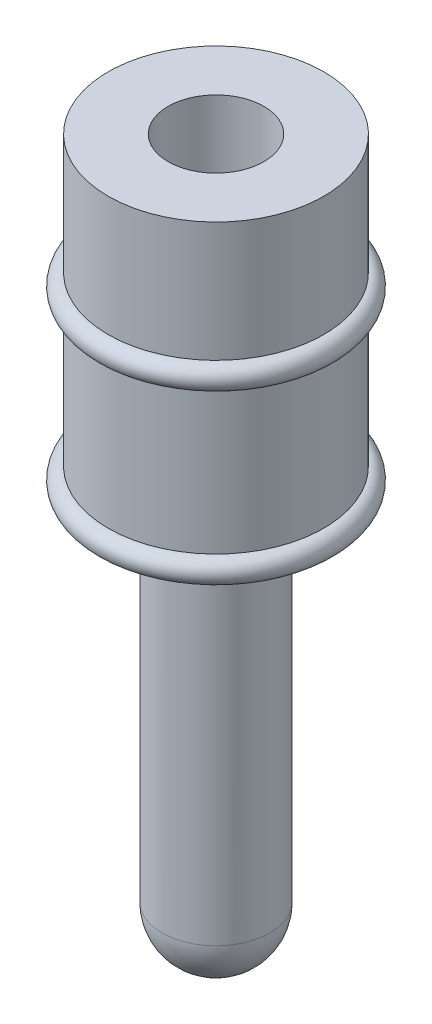
ISO-10303-21;
HEADER;
FILE_DESCRIPTION(('STEP AP214'),'2;1');
FILE_NAME('part.step','',(''),(''),'','','');
FILE_SCHEMA(('AUTOMOTIVE_DESIGN { 1 0 10303 214 1 1 1 1 }'));
ENDSEC;
DATA;
#1=APPLICATION_CONTEXT('core data for automotive mechanical design processes');
#2=APPLICATION_PROTOCOL_DEFINITION('international standard','automotive_design',2000,#1);
#3=PRODUCT_CONTEXT('',#1,'mechanical');
#4=PRODUCT('Part','Part','',(#3));
#5=PRODUCT_RELATED_PRODUCT_CATEGORY('part','',(#4));
#6=PRODUCT_DEFINITION_FORMATION('','',#4);
#7=PRODUCT_DEFINITION_CONTEXT('part definition',#1,'design');
#8=PRODUCT_DEFINITION('design','',#6,#7);
#9=PRODUCT_DEFINITION_SHAPE('','',#8);
#10=(LENGTH_UNIT() NAMED_UNIT(*) SI_UNIT(.MILLI.,.METRE.));
#11=(NAMED_UNIT(*) PLANE_ANGLE_UNIT() SI_UNIT($,.RADIAN.));
#12=(NAMED_UNIT(*) SI_UNIT($,.STERADIAN.) SOLID_ANGLE_UNIT());
#13=UNCERTAINTY_MEASURE_WITH_UNIT(LENGTH_MEASURE(1.E-05),#10,'distance_accuracy_value','');
#14=(GEOMETRIC_REPRESENTATION_CONTEXT(3) GLOBAL_UNCERTAINTY_ASSIGNED_CONTEXT((#13)) GLOBAL_UNIT_ASSIGNED_CONTEXT((#10,
#11,#12)) REPRESENTATION_CONTEXT('',''));
#15=CARTESIAN_POINT('',(0.,0.,0.));
#16=DIRECTION('',(0.,0.,1.));
#17=DIRECTION('',(1.,0.,0.));
#18=AXIS2_PLACEMENT_3D('',#15,#16,#17);
#19=CARTESIAN_POINT('',(0.,0.,0.));
#20=DIRECTION('',(0.,-1.,0.));
#21=DIRECTION('',(0.,0.,-1.));
#22=AXIS2_PLACEMENT_3D('',#19,#20,#21);
#23=CYLINDRICAL_SURFACE('',#22,2.25);
#24=CARTESIAN_POINT('',(0.,12.,0.));
#25=DIRECTION('',(0.,1.,0.));
#26=DIRECTION('',(0.,0.,1.));
#27=AXIS2_PLACEMENT_3D('',#24,#25,#26);
#28=CIRCLE('',#27,2.25);
#29=CARTESIAN_POINT('',(0.,12.,2.25));
#30=VERTEX_POINT('',#29);
#31=EDGE_CURVE('E42',#30,#30,#28,.T.);
#32=ORIENTED_EDGE('',*,*,#31,.F.);
#33=EDGE_LOOP('',(#32));
#34=FACE_BOUND('',#33,.T.);
#35=CARTESIAN_POINT('',(0.,9.,0.));
#36=DIRECTION('',(0.,-1.,0.));
#37=DIRECTION('',(0.,0.,-1.));
#38=AXIS2_PLACEMENT_3D('',#35,#36,#37);
#39=CIRCLE('',#38,2.25);
#40=CARTESIAN_POINT('',(0.,9.,-2.25));
#41=VERTEX_POINT('',#40);
#42=EDGE_CURVE('E10',#41,#41,#39,.T.);
#43=ORIENTED_EDGE('',*,*,#42,.F.);
#44=EDGE_LOOP('',(#43));
#45=FACE_BOUND('',#44,.T.);
#46=ADVANCED_FACE('F40',(#34,#45),#23,.T.);
#47=CARTESIAN_POINT('',(0.,15.,0.));
#48=DIRECTION('',(0.,-1.,0.));
#49=DIRECTION('',(0.,0.,-1.));
#50=AXIS2_PLACEMENT_3D('',#47,#48,#49);
#51=CIRCLE('',#50,2.25);
#52=CARTESIAN_POINT('',(0.,15.,-2.25));
#53=VERTEX_POINT('',#52);
#54=EDGE_CURVE('E55',#53,#53,#51,.T.);
#55=ORIENTED_EDGE('',*,*,#54,.T.);
#56=EDGE_LOOP('',(#55));
#57=FACE_BOUND('',#56,.T.);
#58=CARTESIAN_POINT('',(0.,12.5,0.));
#59=DIRECTION('',(0.,-1.,0.));
#60=DIRECTION('',(0.,0.,-1.));
#61=AXIS2_PLACEMENT_3D('',#58,#59,#60);
#62=CIRCLE('',#61,2.25);
#63=CARTESIAN_POINT('',(0.,12.5,-2.25));
#64=VERTEX_POINT('',#63);
#65=EDGE_CURVE('E48',#64,#64,#62,.T.);
#66=ORIENTED_EDGE('',*,*,#65,.F.);
#67=EDGE_LOOP('',(#66));
#68=FACE_BOUND('',#67,.T.);
#69=ADVANCED_FACE('F98',(#57,#68),#23,.T.);
#70=CARTESIAN_POINT('',(0.,15.,0.));
#71=DIRECTION('',(0.,-1.,0.));
#72=DIRECTION('',(0.,0.,-1.));
#73=AXIS2_PLACEMENT_3D('',#70,#71,#72);
#74=PLANE('',#73);
#75=CARTESIAN_POINT('',(0.,15.,0.));
#76=DIRECTION('',(0.,1.,0.));
#77=DIRECTION('',(-1.,0.,0.));
#78=AXIS2_PLACEMENT_3D('',#75,#76,#77);
#79=CIRCLE('',#78,1.);
#80=CARTESIAN_POINT('',(-1.,15.,0.));
#81=VERTEX_POINT('',#80);
#82=EDGE_CURVE('E74',#81,#81,#79,.T.);
#83=ORIENTED_EDGE('',*,*,#82,.F.);
#84=EDGE_LOOP('',(#83));
#85=FACE_BOUND('',#84,.T.);
#86=ORIENTED_EDGE('',*,*,#54,.F.);
#87=EDGE_LOOP('',(#86));
#88=FACE_BOUND('',#87,.T.);
#89=ADVANCED_FACE('F39',(#85,#88),#74,.F.);
#90=CARTESIAN_POINT('',(0.,11.,0.));
#91=DIRECTION('',(0.,-1.,0.));
#92=DIRECTION('',(1.,0.,0.));
#93=AXIS2_PLACEMENT_3D('',#90,#91,#92);
#94=PLANE('',#93);
#95=CARTESIAN_POINT('',(0.,11.,0.));
#96=DIRECTION('',(0.,1.,0.));
#97=DIRECTION('',(-1.,0.,0.));
#98=AXIS2_PLACEMENT_3D('',#95,#96,#97);
#99=CIRCLE('',#98,1.375);
#100=CARTESIAN_POINT('',(-1.375,11.,0.));
#101=VERTEX_POINT('',#100);
#102=EDGE_CURVE('E64',#101,#101,#99,.T.);
#103=ORIENTED_EDGE('',*,*,#102,.T.);
#104=EDGE_LOOP('',(#103));
#105=FACE_BOUND('',#104,.T.);
#106=ADVANCED_FACE('F111',(#105),#94,.F.);
#107=CARTESIAN_POINT('',(0.,15.,0.));
#108=DIRECTION('',(0.,1.,0.));
#109=DIRECTION('',(-1.,0.,0.));
#110=AXIS2_PLACEMENT_3D('',#107,#108,#109);
#111=CYLINDRICAL_SURFACE('',#110,1.375);
#112=ORIENTED_EDGE('',*,*,#102,.F.);
#113=EDGE_LOOP('',(#112));
#114=FACE_BOUND('',#113,.T.);
#115=CARTESIAN_POINT('',(0.,13.,0.));
#116=DIRECTION('',(0.,1.,0.));
#117=DIRECTION('',(-1.,0.,0.));
#118=AXIS2_PLACEMENT_3D('',#115,#116,#117);
#119=CIRCLE('',#118,1.375);
#120=CARTESIAN_POINT('',(-1.375,13.,0.));
#121=VERTEX_POINT('',#120);
#122=EDGE_CURVE('E67',#121,#121,#119,.T.);
#123=ORIENTED_EDGE('',*,*,#122,.T.);
#124=EDGE_LOOP('',(#123));
#125=FACE_BOUND('',#124,.T.);
#126=ADVANCED_FACE('F112',(#114,#125),#111,.F.);
#127=CARTESIAN_POINT('',(-1.375,13.,0.));
#128=DIRECTION('',(0.,1.,0.));
#129=DIRECTION('',(-1.,0.,0.));
#130=AXIS2_PLACEMENT_3D('',#127,#128,#129);
#131=PLANE('',#130);
#132=ORIENTED_EDGE('',*,*,#122,.F.);
#133=EDGE_LOOP('',(#132));
#134=FACE_BOUND('',#133,.T.);
#135=CARTESIAN_POINT('',(0.,13.,0.));
#136=DIRECTION('',(0.,1.,0.));
#137=DIRECTION('',(-1.,0.,0.));
#138=AXIS2_PLACEMENT_3D('',#135,#136,#137);
#139=CIRCLE('',#138,1.);
#140=CARTESIAN_POINT('',(-1.,13.,0.));
#141=VERTEX_POINT('',#140);
#142=EDGE_CURVE('E66',#141,#141,#139,.T.);
#143=ORIENTED_EDGE('',*,*,#142,.T.);
#144=EDGE_LOOP('',(#143));
#145=FACE_BOUND('',#144,.T.);
#146=ADVANCED_FACE('F117',(#134,#145),#131,.F.);
#147=CARTESIAN_POINT('',(0.,15.,0.));
#148=DIRECTION('',(0.,1.,0.));
#149=DIRECTION('',(-1.,0.,0.));
#150=AXIS2_PLACEMENT_3D('',#147,#148,#149);
#151=CYLINDRICAL_SURFACE('',#150,1.);
#152=ORIENTED_EDGE('',*,*,#142,.F.);
#153=EDGE_LOOP('',(#152));
#154=FACE_BOUND('',#153,.T.);
#155=ORIENTED_EDGE('',*,*,#82,.T.);
#156=EDGE_LOOP('',(#155));
#157=FACE_BOUND('',#156,.T.);
#158=ADVANCED_FACE('F92',(#154,#157),#151,.F.);
#159=CARTESIAN_POINT('',(0.,12.25,0.));
#160=DIRECTION('',(0.,-1.,0.));
#161=DIRECTION('',(0.,0.,-1.));
#162=AXIS2_PLACEMENT_3D('',#159,#160,#161);
#163=TOROIDAL_SURFACE('',#162,2.25,0.25);
#164=ORIENTED_EDGE('',*,*,#31,.T.);
#165=EDGE_LOOP('',(#164));
#166=FACE_BOUND('',#165,.T.);
#167=ORIENTED_EDGE('',*,*,#65,.T.);
#168=EDGE_LOOP('',(#167));
#169=FACE_BOUND('',#168,.T.);
#170=ADVANCED_FACE('F83',(#166,#169),#163,.T.);
#171=CARTESIAN_POINT('',(0.,8.75,0.));
#172=DIRECTION('',(0.,-1.,0.));
#173=DIRECTION('',(0.,0.,-1.));
#174=AXIS2_PLACEMENT_3D('',#171,#172,#173);
#175=TOROIDAL_SURFACE('',#174,2.25,0.25);
#176=CARTESIAN_POINT('',(0.,8.5,0.));
#177=DIRECTION('',(0.,-1.,0.));
#178=DIRECTION('',(0.,0.,-1.));
#179=AXIS2_PLACEMENT_3D('',#176,#177,#178);
#180=CIRCLE('',#179,2.25);
#181=CARTESIAN_POINT('',(0.,8.5,-2.25));
#182=VERTEX_POINT('',#181);
#183=EDGE_CURVE('E71',#182,#182,#180,.T.);
#184=ORIENTED_EDGE('',*,*,#183,.F.);
#185=EDGE_LOOP('',(#184));
#186=FACE_BOUND('',#185,.T.);
#187=ORIENTED_EDGE('',*,*,#42,.T.);
#188=EDGE_LOOP('',(#187));
#189=FACE_BOUND('',#188,.T.);
#190=ADVANCED_FACE('F81',(#186,#189),#175,.T.);
#191=CARTESIAN_POINT('',(0.,1.125,0.));
#192=DIRECTION('',(0.,-1.,0.));
#193=DIRECTION('',(-1.,0.,0.));
#194=AXIS2_PLACEMENT_3D('',#191,#192,#193);
#195=SPHERICAL_SURFACE('',#194,1.125);
#196=CARTESIAN_POINT('',(0.,1.125,0.));
#197=DIRECTION('',(0.,-1.,0.));
#198=DIRECTION('',(0.,0.,-1.));
#199=AXIS2_PLACEMENT_3D('',#196,#197,#198);
#200=CIRCLE('',#199,1.125);
#201=CARTESIAN_POINT('',(0.,1.125,-1.125));
#202=VERTEX_POINT('',#201);
#203=EDGE_CURVE('E58',#202,#202,#200,.T.);
#204=ORIENTED_EDGE('',*,*,#203,.T.);
#205=EDGE_LOOP('',(#204));
#206=FACE_BOUND('',#205,.T.);
#207=ADVANCED_FACE('F84',(#206),#195,.T.);
#208=CARTESIAN_POINT('',(0.,0.,0.));
#209=DIRECTION('',(0.,-1.,0.));
#210=DIRECTION('',(0.,0.,-1.));
#211=AXIS2_PLACEMENT_3D('',#208,#209,#210);
#212=CYLINDRICAL_SURFACE('',#211,1.125);
#213=ORIENTED_EDGE('',*,*,#203,.F.);
#214=EDGE_LOOP('',(#213));
#215=FACE_BOUND('',#214,.T.);
#216=CARTESIAN_POINT('',(0.,8.,0.));
#217=DIRECTION('',(0.,-1.,0.));
#218=DIRECTION('',(0.,0.,-1.));
#219=AXIS2_PLACEMENT_3D('',#216,#217,#218);
#220=CIRCLE('',#219,1.125);
#221=CARTESIAN_POINT('',(0.,8.,-1.125));
#222=VERTEX_POINT('',#221);
#223=EDGE_CURVE('E60',#222,#222,#220,.T.);
#224=ORIENTED_EDGE('',*,*,#223,.T.);
#225=EDGE_LOOP('',(#224));
#226=FACE_BOUND('',#225,.T.);
#227=ADVANCED_FACE('F88',(#215,#226),#212,.T.);
#228=CARTESIAN_POINT('',(0.,8.5,0.));
#229=DIRECTION('',(0.,1.,0.));
#230=DIRECTION('',(0.,0.,1.));
#231=AXIS2_PLACEMENT_3D('',#228,#229,#230);
#232=CONICAL_SURFACE('',#231,2.25,1.15257199721567);
#233=ORIENTED_EDGE('',*,*,#223,.F.);
#234=EDGE_LOOP('',(#233));
#235=FACE_BOUND('',#234,.T.);
#236=ORIENTED_EDGE('',*,*,#183,.T.);
#237=EDGE_LOOP('',(#236));
#238=FACE_BOUND('',#237,.T.);
#239=ADVANCED_FACE('F79',(#235,#238),#232,.T.);
#240=CLOSED_SHELL('',(#46,#69,#89,#106,#126,#146,#158,#170,#190,#207,#227,#239));
#241=MANIFOLD_SOLID_BREP('B2',#240);
#242=ADVANCED_BREP_SHAPE_REPRESENTATION('',(#18,#241),#14);
#243=SHAPE_DEFINITION_REPRESENTATION(#9,#242);
ENDSEC;
END-ISO-10303-21;
